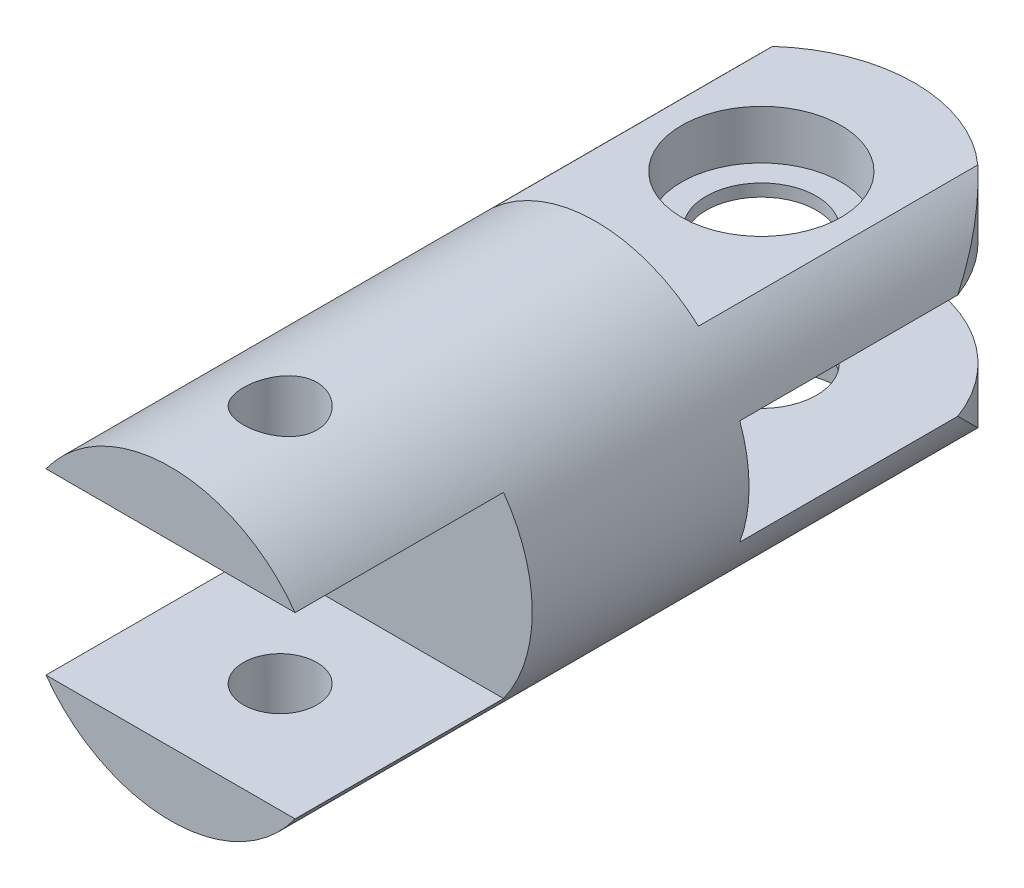
ISO-10303-21;
HEADER;
FILE_DESCRIPTION(('STEP AP214'),'2;1');
FILE_NAME('part.step','',(''),(''),'','','');
FILE_SCHEMA(('AUTOMOTIVE_DESIGN { 1 0 10303 214 1 1 1 1 }'));
ENDSEC;
DATA;
#1=APPLICATION_CONTEXT('core data for automotive mechanical design processes');
#2=APPLICATION_PROTOCOL_DEFINITION('international standard','automotive_design',2000,#1);
#3=PRODUCT_CONTEXT('',#1,'mechanical');
#4=PRODUCT('Part','Part','',(#3));
#5=PRODUCT_RELATED_PRODUCT_CATEGORY('part','',(#4));
#6=PRODUCT_DEFINITION_FORMATION('','',#4);
#7=PRODUCT_DEFINITION_CONTEXT('part definition',#1,'design');
#8=PRODUCT_DEFINITION('design','',#6,#7);
#9=PRODUCT_DEFINITION_SHAPE('','',#8);
#10=(LENGTH_UNIT() NAMED_UNIT(*) SI_UNIT(.MILLI.,.METRE.));
#11=(NAMED_UNIT(*) PLANE_ANGLE_UNIT() SI_UNIT($,.RADIAN.));
#12=(NAMED_UNIT(*) SI_UNIT($,.STERADIAN.) SOLID_ANGLE_UNIT());
#13=UNCERTAINTY_MEASURE_WITH_UNIT(LENGTH_MEASURE(1.E-05),#10,'distance_accuracy_value','');
#14=(GEOMETRIC_REPRESENTATION_CONTEXT(3) GLOBAL_UNCERTAINTY_ASSIGNED_CONTEXT((#13)) GLOBAL_UNIT_ASSIGNED_CONTEXT((#10,
#11,#12)) REPRESENTATION_CONTEXT('',''));
#15=CARTESIAN_POINT('',(0.,0.,0.));
#16=DIRECTION('',(0.,0.,1.));
#17=DIRECTION('',(1.,0.,0.));
#18=AXIS2_PLACEMENT_3D('',#15,#16,#17);
#19=CARTESIAN_POINT('',(0.,0.,-60.6869213965663));
#20=DIRECTION('',(0.,0.,1.));
#21=DIRECTION('',(1.,0.,0.));
#22=AXIS2_PLACEMENT_3D('',#19,#20,#21);
#23=CYLINDRICAL_SURFACE('',#22,12.5);
#24=CARTESIAN_POINT('',(0.,-12.5,-11.9404654544865));
#25=CARTESIAN_POINT('',(-0.165963929028716,-12.4999970714968,-11.9404604304092));
#26=CARTESIAN_POINT('',(-0.331985420928068,-12.4966615634859,-11.9266470442504));
#27=CARTESIAN_POINT('',(-0.659284290971381,-12.4836783946933,-11.8718327148911));
#28=CARTESIAN_POINT('',(-0.820558683214275,-12.4740268462166,-11.8308150264918));
#29=CARTESIAN_POINT('',(-1.13358839471402,-12.4494823208195,-11.7229731199821));
#30=CARTESIAN_POINT('',(-1.28535442324823,-12.4345953702841,-11.6561785646289));
#31=CARTESIAN_POINT('',(-1.57552517879763,-12.4011725442513,-11.4987800180406));
#32=CARTESIAN_POINT('',(-1.71392971475166,-12.3826366165873,-11.4081756864092));
#33=CARTESIAN_POINT('',(-1.97609263393972,-12.3435386014785,-11.2039012761109));
#34=CARTESIAN_POINT('',(-2.0995595210048,-12.3229472454311,-11.0898626734372));
#35=CARTESIAN_POINT('',(-2.32581080811943,-12.2822574370147,-10.8427465854218));
#36=CARTESIAN_POINT('',(-2.42859304624489,-12.2621590363612,-10.7096671124455));
#37=CARTESIAN_POINT('',(-2.61189993555015,-12.224437969062,-10.426019621469));
#38=CARTESIAN_POINT('',(-2.69210377047565,-12.2068525815312,-10.2752388707276));
#39=CARTESIAN_POINT('',(-2.82591582947333,-12.1765733412448,-9.96184561935797));
#40=CARTESIAN_POINT('',(-2.87952794169564,-12.1638787734309,-9.7992348524633));
#41=CARTESIAN_POINT('',(-2.95765058108663,-12.1451184675007,-9.46998888121755));
#42=CARTESIAN_POINT('',(-2.98268262400617,-12.1389341034343,-9.30348433296095));
#43=CARTESIAN_POINT('',(-3.00455808879087,-12.1335389605945,-8.9685330748437));
#44=CARTESIAN_POINT('',(-3.00140571682399,-12.1343271412568,-8.80008665852954));
#45=CARTESIAN_POINT('',(-2.96741912081942,-12.1426811387008,-8.46998948847357));
#46=CARTESIAN_POINT('',(-2.93720103400494,-12.1500960921292,-8.3082708892969));
#47=CARTESIAN_POINT('',(-2.85092141637189,-12.1706283738785,-7.99226813783862));
#48=CARTESIAN_POINT('',(-2.79485817372027,-12.1837460799133,-7.83798447875203));
#49=CARTESIAN_POINT('',(-2.65794121231782,-12.2143476734445,-7.5395524764021));
#50=CARTESIAN_POINT('',(-2.5768594824696,-12.2318714325758,-7.39551300156977));
#51=CARTESIAN_POINT('',(-2.39236688956383,-12.2692875046197,-7.12286095376388));
#52=CARTESIAN_POINT('',(-2.28895240342647,-12.2891802016137,-6.99425088920135));
#53=CARTESIAN_POINT('',(-2.05951493908847,-12.329732025739,-6.75257188416772));
#54=CARTESIAN_POINT('',(-1.93297064389908,-12.3503975788014,-6.63999835542424));
#55=CARTESIAN_POINT('',(-1.66255592459692,-12.3896951594929,-6.43758073474007));
#56=CARTESIAN_POINT('',(-1.51868504982141,-12.4083271342049,-6.34773723419384));
#57=CARTESIAN_POINT('',(-1.21702847718581,-12.4415394956922,-6.19316823387368));
#58=CARTESIAN_POINT('',(-1.05920278696054,-12.4561077058019,-6.12851799824867));
#59=CARTESIAN_POINT('',(-0.734497606078675,-12.4794620474154,-6.02680037543787));
#60=CARTESIAN_POINT('',(-0.567619713387661,-12.4882491958651,-5.98972813685964));
#61=CARTESIAN_POINT('',(-0.233787399651664,-12.4989027542709,-5.94496338983442));
#62=CARTESIAN_POINT('',(-0.0669284805450073,-12.5009282130753,-5.93659556202488));
#63=CARTESIAN_POINT('',(0.26580438158663,-12.4982807419474,-5.94763222133736));
#64=CARTESIAN_POINT('',(0.431678404764953,-12.4936083648176,-5.96703441647369));
#65=CARTESIAN_POINT('',(0.755422580108848,-12.4781916395217,-6.03250243300284));
#66=CARTESIAN_POINT('',(0.913370579311304,-12.4675301590363,-6.07820456406026));
#67=CARTESIAN_POINT('',(1.21935330013476,-12.4413335015664,-6.19456364618172));
#68=CARTESIAN_POINT('',(1.3673870666415,-12.4257978558334,-6.26522299746456));
#69=CARTESIAN_POINT('',(1.6520615099557,-12.3911910149582,-6.43083204808431));
#70=CARTESIAN_POINT('',(1.78847176740355,-12.3720653178033,-6.52616617141083));
#71=CARTESIAN_POINT('',(2.04359904096632,-12.3324936406987,-6.73792238349987));
#72=CARTESIAN_POINT('',(2.16231325074337,-12.3120474520734,-6.85434781056723));
#73=CARTESIAN_POINT('',(2.38142453789941,-12.2715742142771,-7.10810628569501));
#74=CARTESIAN_POINT('',(2.4813497404737,-12.2515669262668,-7.24585057656856));
#75=CARTESIAN_POINT('',(2.65666020824081,-12.2147538797452,-7.53655588238319));
#76=CARTESIAN_POINT('',(2.7320465722335,-12.1979479778962,-7.68951621557993));
#77=CARTESIAN_POINT('',(2.85558993518171,-12.1696189519335,-8.00547796803044));
#78=CARTESIAN_POINT('',(2.90390754385905,-12.1580647463107,-8.16841365790768));
#79=CARTESIAN_POINT('',(2.97238380283979,-12.1415072663683,-8.50041163950715));
#80=CARTESIAN_POINT('',(2.99254804274991,-12.1365026916888,-8.66947270824823));
#81=CARTESIAN_POINT('',(3.00387066449353,-12.1337046220624,-9.00413615476706));
#82=CARTESIAN_POINT('',(2.99578106592266,-12.1357241633848,-9.16971195081315));
#83=CARTESIAN_POINT('',(2.95253345626267,-12.1463176460425,-9.49706521871015));
#84=CARTESIAN_POINT('',(2.91737590900096,-12.1548914750658,-9.65884275559781));
#85=CARTESIAN_POINT('',(2.82138591303537,-12.1775274976748,-9.9732630070347));
#86=CARTESIAN_POINT('',(2.76068402045612,-12.191561756094,-10.1259477270702));
#87=CARTESIAN_POINT('',(2.61543373580583,-12.2235433612686,-10.4190698683701));
#88=CARTESIAN_POINT('',(2.53088229934855,-12.2414912075257,-10.5595057230728));
#89=CARTESIAN_POINT('',(2.33793007708464,-12.279819325529,-10.827802454606));
#90=CARTESIAN_POINT('',(2.22900267979018,-12.3002478697533,-10.9552777775852));
#91=CARTESIAN_POINT('',(1.99143074773237,-12.3409359831145,-11.1903854425384));
#92=CARTESIAN_POINT('',(1.86278158874234,-12.361195511444,-11.2980131176967));
#93=CARTESIAN_POINT('',(1.5868829988014,-12.3996570299581,-11.4920747140412));
#94=CARTESIAN_POINT('',(1.43936414359402,-12.4178200201219,-11.5781338599285));
#95=CARTESIAN_POINT('',(1.13153622828567,-12.4496380610582,-11.7240949872343));
#96=CARTESIAN_POINT('',(0.971236973691223,-12.4632965272855,-11.7840167978781));
#97=CARTESIAN_POINT('',(0.675887025694768,-12.4824059901497,-11.8665040796242));
#98=CARTESIAN_POINT('',(0.542312066268424,-12.4889599449579,-11.8941820702722));
#99=CARTESIAN_POINT('',(0.272504227478251,-12.4977580149525,-11.9311642353383));
#100=CARTESIAN_POINT('',(0.136271517915778,-12.5000024045682,-11.940469579712));
#101=CARTESIAN_POINT('',(0.,-12.5,-11.9404654544865));
#102=B_SPLINE_CURVE_WITH_KNOTS('',3,(#24,#25,#26,#27,#28,#29,#30,#31,#32,#33,#34,#35,#36,#37,
#38,#39,#40,#41,#42,#43,#44,#45,#46,#47,#48,#49,#50,#51,#52,#53,#54,#55,#56,#57,#58,#59,#60,#61,
#62,#63,#64,#65,#66,#67,#68,#69,#70,#71,#72,#73,#74,#75,#76,#77,#78,#79,#80,#81,#82,#83,#84,#85,
#86,#87,#88,#89,#90,#91,#92,#93,#94,#95,#96,#97,#98,#99,#100,#101),.UNSPECIFIED.,.T.,.F.,(4,2,2,
2,2,2,2,2,2,2,2,2,2,2,2,2,2,2,2,2,2,2,2,2,2,2,2,2,2,2,2,2,2,2,2,2,2,2,4),(0.,0.497392599366679,
0.995091645758825,1.49221966408501,1.9893547899852,2.49500570148357,3.00070943533307,
3.51327262050849,4.02576083835037,4.52873995359111,5.03164400680466,5.52338274964839,
6.01515406709138,6.51154667521171,7.00801987450003,7.51749958381935,8.02699254752171,
8.53799614678204,9.04890983140415,9.54771776810826,10.0464845383097,10.5385143736981,
11.0305915421211,11.5308523313794,12.031192370573,12.5427824523192,13.0543496229378,
13.5628484119093,14.0712462285018,14.5662165454702,15.0611783809799,15.5536406351284,
16.0461657803879,16.5505844610431,17.0551215958269,17.5678974206352,18.0802835459069,
18.4887142303991,18.897118905514),.UNSPECIFIED.);
#103=CARTESIAN_POINT('',(0.,-12.5,-11.9404654544865));
#104=VERTEX_POINT('',#103);
#105=EDGE_CURVE('E257',#104,#104,#102,.T.);
#106=ORIENTED_EDGE('',*,*,#105,.T.);
#107=EDGE_LOOP('',(#106));
#108=FACE_BOUND('',#107,.T.);
#109=CARTESIAN_POINT('',(0.,0.,-48.1869213965663));
#110=DIRECTION('',(0.,0.707106781186547,0.707106781186547));
#111=DIRECTION('',(0.,-0.707106781186547,0.707106781186547));
#112=AXIS2_PLACEMENT_3D('',#109,#110,#111);
#113=ELLIPSE('',#112,17.6776695296637,12.5);
#114=CARTESIAN_POINT('',(-11.7434279078634,4.28274456077105,-52.4696659573374));
#115=VERTEX_POINT('',#114);
#116=CARTESIAN_POINT('',(-8.37141884147935,9.28274456077105,-57.4696659573374));
#117=VERTEX_POINT('',#116);
#118=EDGE_CURVE('E157',#115,#117,#113,.F.);
#119=ORIENTED_EDGE('',*,*,#118,.F.);
#120=DIRECTION('',(0.,0.,-1.));
#121=VECTOR('',#120,1.);
#122=CARTESIAN_POINT('',(-11.7434279078634,4.28274456077105,-34.6869213965663));
#123=LINE('',#122,#121);
#124=CARTESIAN_POINT('',(-11.7434279078634,4.28274456077105,-34.6869213965663));
#125=VERTEX_POINT('',#124);
#126=EDGE_CURVE('E114',#125,#115,#123,.T.);
#127=ORIENTED_EDGE('',*,*,#126,.F.);
#128=CARTESIAN_POINT('',(0.,0.,-34.6869213965663));
#129=DIRECTION('',(0.,0.,-1.));
#130=DIRECTION('',(-1.,0.,0.));
#131=AXIS2_PLACEMENT_3D('',#128,#129,#130);
#132=CIRCLE('',#131,12.5);
#133=CARTESIAN_POINT('',(-11.7434279078634,-4.28274456077105,-34.6869213965663));
#134=VERTEX_POINT('',#133);
#135=EDGE_CURVE('E100',#134,#125,#132,.T.);
#136=ORIENTED_EDGE('',*,*,#135,.F.);
#137=DIRECTION('',(0.,0.,-1.));
#138=VECTOR('',#137,1.);
#139=CARTESIAN_POINT('',(-11.7434279078634,-4.28274456077105,-34.6869213965663));
#140=LINE('',#139,#138);
#141=CARTESIAN_POINT('',(-11.7434279078634,-4.28274456077105,-52.4696659573374));
#142=VERTEX_POINT('',#141);
#143=EDGE_CURVE('E167',#134,#142,#140,.T.);
#144=ORIENTED_EDGE('',*,*,#143,.T.);
#145=CARTESIAN_POINT('',(0.,0.,-48.1869213965663));
#146=DIRECTION('',(0.,-0.707106781186547,0.707106781186547));
#147=DIRECTION('',(0.,0.707106781186547,0.707106781186547));
#148=AXIS2_PLACEMENT_3D('',#145,#146,#147);
#149=ELLIPSE('',#148,17.6776695296637,12.5);
#150=CARTESIAN_POINT('',(-8.37141884147936,-9.28274456077105,-57.4696659573374));
#151=VERTEX_POINT('',#150);
#152=EDGE_CURVE('E161',#151,#142,#149,.F.);
#153=ORIENTED_EDGE('',*,*,#152,.F.);
#154=DIRECTION('',(0.,0.,-1.));
#155=VECTOR('',#154,1.);
#156=CARTESIAN_POINT('',(-8.37141884147936,-9.28274456077105,-34.6869213965663));
#157=LINE('',#156,#155);
#158=CARTESIAN_POINT('',(-8.37141884147936,-9.28274456077105,-34.6869213965663));
#159=VERTEX_POINT('',#158);
#160=EDGE_CURVE('E101',#159,#151,#157,.T.);
#161=ORIENTED_EDGE('',*,*,#160,.F.);
#162=CARTESIAN_POINT('',(0.,0.,-34.6869213965663));
#163=DIRECTION('',(0.,0.,-1.));
#164=DIRECTION('',(-1.,0.,0.));
#165=AXIS2_PLACEMENT_3D('',#162,#163,#164);
#166=CIRCLE('',#165,12.5);
#167=CARTESIAN_POINT('',(8.37141884147936,-9.28274456077105,-34.6869213965663));
#168=VERTEX_POINT('',#167);
#169=EDGE_CURVE('E105',#168,#159,#166,.T.);
#170=ORIENTED_EDGE('',*,*,#169,.F.);
#171=DIRECTION('',(0.,0.,-1.));
#172=VECTOR('',#171,1.);
#173=CARTESIAN_POINT('',(8.37141884147936,-9.28274456077105,-34.6869213965663));
#174=LINE('',#173,#172);
#175=CARTESIAN_POINT('',(8.37141884147936,-9.28274456077105,-57.4696659573374));
#176=VERTEX_POINT('',#175);
#177=EDGE_CURVE('E89',#168,#176,#174,.T.);
#178=ORIENTED_EDGE('',*,*,#177,.T.);
#179=CARTESIAN_POINT('',(11.7434279078634,-4.28274456077105,-52.4696659573374));
#180=VERTEX_POINT('',#179);
#181=EDGE_CURVE('E111',#180,#176,#149,.F.);
#182=ORIENTED_EDGE('',*,*,#181,.F.);
#183=DIRECTION('',(0.,0.,-1.));
#184=VECTOR('',#183,1.);
#185=CARTESIAN_POINT('',(11.7434279078635,-4.28274456077104,-34.6869213965663));
#186=LINE('',#185,#184);
#187=CARTESIAN_POINT('',(11.7434279078635,-4.28274456077104,-34.6869213965663));
#188=VERTEX_POINT('',#187);
#189=EDGE_CURVE('E185',#188,#180,#186,.T.);
#190=ORIENTED_EDGE('',*,*,#189,.F.);
#191=CARTESIAN_POINT('',(0.,0.,-34.6869213965663));
#192=DIRECTION('',(0.,0.,-1.));
#193=DIRECTION('',(-1.,0.,0.));
#194=AXIS2_PLACEMENT_3D('',#191,#192,#193);
#195=CIRCLE('',#194,12.5);
#196=CARTESIAN_POINT('',(11.7434279078634,4.28274456077105,-34.6869213965663));
#197=VERTEX_POINT('',#196);
#198=EDGE_CURVE('E178',#197,#188,#195,.T.);
#199=ORIENTED_EDGE('',*,*,#198,.F.);
#200=DIRECTION('',(0.,0.,-1.));
#201=VECTOR('',#200,1.);
#202=CARTESIAN_POINT('',(11.7434279078634,4.28274456077105,-34.6869213965663));
#203=LINE('',#202,#201);
#204=CARTESIAN_POINT('',(11.7434279078634,4.28274456077105,-52.4696659573374));
#205=VERTEX_POINT('',#204);
#206=EDGE_CURVE('E187',#197,#205,#203,.T.);
#207=ORIENTED_EDGE('',*,*,#206,.T.);
#208=CARTESIAN_POINT('',(8.37141884147935,9.28274456077105,-57.4696659573374));
#209=VERTEX_POINT('',#208);
#210=EDGE_CURVE('E154',#209,#205,#113,.F.);
#211=ORIENTED_EDGE('',*,*,#210,.F.);
#212=DIRECTION('',(0.,0.,-1.));
#213=VECTOR('',#212,1.);
#214=CARTESIAN_POINT('',(8.37141884147936,9.28274456077105,-34.6869213965663));
#215=LINE('',#214,#213);
#216=CARTESIAN_POINT('',(8.37141884147936,9.28274456077105,-34.6869213965663));
#217=VERTEX_POINT('',#216);
#218=EDGE_CURVE('E169',#217,#209,#215,.T.);
#219=ORIENTED_EDGE('',*,*,#218,.F.);
#220=CARTESIAN_POINT('',(0.,0.,-34.6869213965663));
#221=DIRECTION('',(0.,0.,-1.));
#222=DIRECTION('',(-1.,0.,0.));
#223=AXIS2_PLACEMENT_3D('',#220,#221,#222);
#224=CIRCLE('',#223,12.5);
#225=CARTESIAN_POINT('',(-8.37141884147936,9.28274456077105,-34.6869213965663));
#226=VERTEX_POINT('',#225);
#227=EDGE_CURVE('E164',#226,#217,#224,.T.);
#228=ORIENTED_EDGE('',*,*,#227,.F.);
#229=DIRECTION('',(0.,0.,-1.));
#230=VECTOR('',#229,1.);
#231=CARTESIAN_POINT('',(-8.37141884147936,9.28274456077105,-34.6869213965663));
#232=LINE('',#231,#230);
#233=EDGE_CURVE('E62',#226,#117,#232,.T.);
#234=ORIENTED_EDGE('',*,*,#233,.T.);
#235=EDGE_LOOP('',(#119,#127,#136,#144,#153,#161,#170,#178,#182,#190,#199,#207,#211,#219,#228,#234));
#236=FACE_BOUND('',#235,.T.);
#237=CARTESIAN_POINT('',(0.,0.,0.));
#238=DIRECTION('',(0.,0.,1.));
#239=DIRECTION('',(1.,0.,0.));
#240=AXIS2_PLACEMENT_3D('',#237,#238,#239);
#241=CIRCLE('',#240,12.5);
#242=CARTESIAN_POINT('',(-10.1592108826775,-7.28288639491837,0.));
#243=VERTEX_POINT('',#242);
#244=CARTESIAN_POINT('',(10.1592108826775,-7.28288639491837,0.));
#245=VERTEX_POINT('',#244);
#246=EDGE_CURVE('E119',#243,#245,#241,.T.);
#247=ORIENTED_EDGE('',*,*,#246,.F.);
#248=DIRECTION('',(0.,0.,1.));
#249=VECTOR('',#248,1.);
#250=CARTESIAN_POINT('',(-10.1592108826775,-7.28288639491837,-17.));
#251=LINE('',#250,#249);
#252=CARTESIAN_POINT('',(-10.1592108826775,-7.28288639491837,-17.));
#253=VERTEX_POINT('',#252);
#254=EDGE_CURVE('E484',#253,#243,#251,.T.);
#255=ORIENTED_EDGE('',*,*,#254,.F.);
#256=CARTESIAN_POINT('',(0.,0.,-17.));
#257=DIRECTION('',(0.,0.,1.));
#258=DIRECTION('',(1.,0.,0.));
#259=AXIS2_PLACEMENT_3D('',#256,#257,#258);
#260=CIRCLE('',#259,12.5);
#261=CARTESIAN_POINT('',(-10.1592108826775,7.28288639491837,-17.));
#262=VERTEX_POINT('',#261);
#263=EDGE_CURVE('E480',#262,#253,#260,.T.);
#264=ORIENTED_EDGE('',*,*,#263,.F.);
#265=DIRECTION('',(0.,0.,1.));
#266=VECTOR('',#265,1.);
#267=CARTESIAN_POINT('',(-10.1592108826775,7.28288639491837,-17.));
#268=LINE('',#267,#266);
#269=CARTESIAN_POINT('',(-10.1592108826775,7.28288639491837,0.));
#270=VERTEX_POINT('',#269);
#271=EDGE_CURVE('E476',#262,#270,#268,.T.);
#272=ORIENTED_EDGE('',*,*,#271,.T.);
#273=CARTESIAN_POINT('',(10.1592108826775,7.28288639491837,0.));
#274=VERTEX_POINT('',#273);
#275=EDGE_CURVE('E46',#274,#270,#241,.T.);
#276=ORIENTED_EDGE('',*,*,#275,.F.);
#277=DIRECTION('',(0.,0.,1.));
#278=VECTOR('',#277,1.);
#279=CARTESIAN_POINT('',(10.1592108826775,7.28288639491837,-17.));
#280=LINE('',#279,#278);
#281=CARTESIAN_POINT('',(10.1592108826775,7.28288639491837,-17.));
#282=VERTEX_POINT('',#281);
#283=EDGE_CURVE('E54',#282,#274,#280,.T.);
#284=ORIENTED_EDGE('',*,*,#283,.F.);
#285=CARTESIAN_POINT('',(0.,0.,-17.));
#286=DIRECTION('',(0.,0.,1.));
#287=DIRECTION('',(1.,0.,0.));
#288=AXIS2_PLACEMENT_3D('',#285,#286,#287);
#289=CIRCLE('',#288,12.5);
#290=CARTESIAN_POINT('',(10.1592108826775,-7.28288639491837,-17.));
#291=VERTEX_POINT('',#290);
#292=EDGE_CURVE('E492',#291,#282,#289,.T.);
#293=ORIENTED_EDGE('',*,*,#292,.F.);
#294=DIRECTION('',(0.,0.,1.));
#295=VECTOR('',#294,1.);
#296=CARTESIAN_POINT('',(10.1592108826775,-7.28288639491837,-17.));
#297=LINE('',#296,#295);
#298=EDGE_CURVE('E139',#291,#245,#297,.T.);
#299=ORIENTED_EDGE('',*,*,#298,.T.);
#300=EDGE_LOOP('',(#247,#255,#264,#272,#276,#284,#293,#299));
#301=FACE_BOUND('',#300,.T.);
#302=CARTESIAN_POINT('',(0.,12.5,-11.9404654544865));
#303=CARTESIAN_POINT('',(0.165963929028716,12.4999970714968,-11.9404604304092));
#304=CARTESIAN_POINT('',(0.331985420928068,12.4966615634859,-11.9266470442504));
#305=CARTESIAN_POINT('',(0.659284290971381,12.4836783946933,-11.8718327148911));
#306=CARTESIAN_POINT('',(0.820558683214275,12.4740268462166,-11.8308150264918));
#307=CARTESIAN_POINT('',(1.13358839471402,12.4494823208195,-11.7229731199821));
#308=CARTESIAN_POINT('',(1.28535442324823,12.4345953702841,-11.6561785646289));
#309=CARTESIAN_POINT('',(1.57552517879763,12.4011725442513,-11.4987800180406));
#310=CARTESIAN_POINT('',(1.71392971475166,12.3826366165873,-11.4081756864092));
#311=CARTESIAN_POINT('',(1.97609263393972,12.3435386014785,-11.2039012761109));
#312=CARTESIAN_POINT('',(2.0995595210048,12.3229472454311,-11.0898626734372));
#313=CARTESIAN_POINT('',(2.32581080811943,12.2822574370147,-10.8427465854218));
#314=CARTESIAN_POINT('',(2.42859304624489,12.2621590363612,-10.7096671124455));
#315=CARTESIAN_POINT('',(2.61189993555015,12.224437969062,-10.426019621469));
#316=CARTESIAN_POINT('',(2.69210377047565,12.2068525815312,-10.2752388707276));
#317=CARTESIAN_POINT('',(2.82591582947333,12.1765733412448,-9.96184561935797));
#318=CARTESIAN_POINT('',(2.87952794169564,12.1638787734309,-9.7992348524633));
#319=CARTESIAN_POINT('',(2.95765058108663,12.1451184675007,-9.46998888121755));
#320=CARTESIAN_POINT('',(2.98268262400617,12.1389341034343,-9.30348433296095));
#321=CARTESIAN_POINT('',(3.00455808879087,12.1335389605945,-8.9685330748437));
#322=CARTESIAN_POINT('',(3.00140571682399,12.1343271412568,-8.80008665852954));
#323=CARTESIAN_POINT('',(2.96741912081942,12.1426811387008,-8.46998948847357));
#324=CARTESIAN_POINT('',(2.93720103400494,12.1500960921292,-8.3082708892969));
#325=CARTESIAN_POINT('',(2.85092141637189,12.1706283738785,-7.99226813783862));
#326=CARTESIAN_POINT('',(2.79485817372027,12.1837460799133,-7.83798447875203));
#327=CARTESIAN_POINT('',(2.65794121231782,12.2143476734445,-7.5395524764021));
#328=CARTESIAN_POINT('',(2.5768594824696,12.2318714325758,-7.39551300156977));
#329=CARTESIAN_POINT('',(2.39236688956383,12.2692875046197,-7.12286095376388));
#330=CARTESIAN_POINT('',(2.28895240342647,12.2891802016137,-6.99425088920135));
#331=CARTESIAN_POINT('',(2.05951493908847,12.329732025739,-6.75257188416772));
#332=CARTESIAN_POINT('',(1.93297064389908,12.3503975788014,-6.63999835542424));
#333=CARTESIAN_POINT('',(1.66255592459692,12.3896951594929,-6.43758073474007));
#334=CARTESIAN_POINT('',(1.51868504982141,12.4083271342049,-6.34773723419384));
#335=CARTESIAN_POINT('',(1.21702847718581,12.4415394956922,-6.19316823387368));
#336=CARTESIAN_POINT('',(1.05920278696054,12.4561077058019,-6.12851799824867));
#337=CARTESIAN_POINT('',(0.734497606078675,12.4794620474154,-6.02680037543787));
#338=CARTESIAN_POINT('',(0.567619713387661,12.4882491958651,-5.98972813685964));
#339=CARTESIAN_POINT('',(0.233787399651664,12.4989027542709,-5.94496338983442));
#340=CARTESIAN_POINT('',(0.0669284805450073,12.5009282130753,-5.93659556202488));
#341=CARTESIAN_POINT('',(-0.26580438158663,12.4982807419474,-5.94763222133736));
#342=CARTESIAN_POINT('',(-0.431678404764953,12.4936083648176,-5.96703441647369));
#343=CARTESIAN_POINT('',(-0.755422580108848,12.4781916395217,-6.03250243300284));
#344=CARTESIAN_POINT('',(-0.913370579311304,12.4675301590363,-6.07820456406026));
#345=CARTESIAN_POINT('',(-1.21935330013476,12.4413335015664,-6.19456364618172));
#346=CARTESIAN_POINT('',(-1.3673870666415,12.4257978558334,-6.26522299746456));
#347=CARTESIAN_POINT('',(-1.6520615099557,12.3911910149582,-6.43083204808431));
#348=CARTESIAN_POINT('',(-1.78847176740355,12.3720653178033,-6.52616617141083));
#349=CARTESIAN_POINT('',(-2.04359904096632,12.3324936406987,-6.73792238349987));
#350=CARTESIAN_POINT('',(-2.16231325074337,12.3120474520734,-6.85434781056723));
#351=CARTESIAN_POINT('',(-2.38142453789941,12.2715742142771,-7.10810628569501));
#352=CARTESIAN_POINT('',(-2.4813497404737,12.2515669262668,-7.24585057656856));
#353=CARTESIAN_POINT('',(-2.65666020824081,12.2147538797452,-7.53655588238319));
#354=CARTESIAN_POINT('',(-2.7320465722335,12.1979479778962,-7.68951621557993));
#355=CARTESIAN_POINT('',(-2.85558993518171,12.1696189519335,-8.00547796803044));
#356=CARTESIAN_POINT('',(-2.90390754385905,12.1580647463107,-8.16841365790768));
#357=CARTESIAN_POINT('',(-2.97238380283979,12.1415072663683,-8.50041163950715));
#358=CARTESIAN_POINT('',(-2.99254804274991,12.1365026916888,-8.66947270824823));
#359=CARTESIAN_POINT('',(-3.00387066449353,12.1337046220624,-9.00413615476706));
#360=CARTESIAN_POINT('',(-2.99578106592266,12.1357241633848,-9.16971195081315));
#361=CARTESIAN_POINT('',(-2.95253345626267,12.1463176460425,-9.49706521871015));
#362=CARTESIAN_POINT('',(-2.91737590900096,12.1548914750658,-9.65884275559781));
#363=CARTESIAN_POINT('',(-2.82138591303537,12.1775274976748,-9.9732630070347));
#364=CARTESIAN_POINT('',(-2.76068402045612,12.191561756094,-10.1259477270702));
#365=CARTESIAN_POINT('',(-2.61543373580583,12.2235433612686,-10.4190698683701));
#366=CARTESIAN_POINT('',(-2.53088229934855,12.2414912075257,-10.5595057230728));
#367=CARTESIAN_POINT('',(-2.33793007708464,12.279819325529,-10.827802454606));
#368=CARTESIAN_POINT('',(-2.22900267979018,12.3002478697533,-10.9552777775852));
#369=CARTESIAN_POINT('',(-1.99143074773237,12.3409359831145,-11.1903854425384));
#370=CARTESIAN_POINT('',(-1.86278158874234,12.361195511444,-11.2980131176967));
#371=CARTESIAN_POINT('',(-1.5868829988014,12.3996570299581,-11.4920747140412));
#372=CARTESIAN_POINT('',(-1.43936414359402,12.4178200201219,-11.5781338599285));
#373=CARTESIAN_POINT('',(-1.13153622828567,12.4496380610582,-11.7240949872343));
#374=CARTESIAN_POINT('',(-0.971236973691223,12.4632965272855,-11.7840167978781));
#375=CARTESIAN_POINT('',(-0.675887025694768,12.4824059901497,-11.8665040796242));
#376=CARTESIAN_POINT('',(-0.542312066268424,12.4889599449579,-11.8941820702722));
#377=CARTESIAN_POINT('',(-0.272504227478251,12.4977580149525,-11.9311642353383));
#378=CARTESIAN_POINT('',(-0.136271517915778,12.5000024045682,-11.940469579712));
#379=CARTESIAN_POINT('',(0.,12.5,-11.9404654544865));
#380=B_SPLINE_CURVE_WITH_KNOTS('',3,(#302,#303,#304,#305,#306,#307,#308,#309,#310,#311,#312,
#313,#314,#315,#316,#317,#318,#319,#320,#321,#322,#323,#324,#325,#326,#327,#328,#329,#330,#331,
#332,#333,#334,#335,#336,#337,#338,#339,#340,#341,#342,#343,#344,#345,#346,#347,#348,#349,#350,
#351,#352,#353,#354,#355,#356,#357,#358,#359,#360,#361,#362,#363,#364,#365,#366,#367,#368,#369,
#370,#371,#372,#373,#374,#375,#376,#377,#378,#379),.UNSPECIFIED.,.T.,.F.,(4,2,2,2,2,2,2,2,2,2,2,
2,2,2,2,2,2,2,2,2,2,2,2,2,2,2,2,2,2,2,2,2,2,2,2,2,2,2,4),(0.,0.497392599366679,
0.995091645758825,1.49221966408501,1.9893547899852,2.49500570148357,3.00070943533307,
3.51327262050849,4.02576083835037,4.52873995359111,5.03164400680466,5.52338274964839,
6.01515406709138,6.51154667521171,7.00801987450003,7.51749958381935,8.02699254752171,
8.53799614678204,9.04890983140415,9.54771776810826,10.0464845383097,10.5385143736981,
11.0305915421211,11.5308523313794,12.031192370573,12.5427824523192,13.0543496229378,
13.5628484119093,14.0712462285018,14.5662165454702,15.0611783809799,15.5536406351284,
16.0461657803879,16.5505844610431,17.0551215958269,17.5678974206352,18.0802835459069,
18.4887142303991,18.897118905514),.UNSPECIFIED.);
#381=CARTESIAN_POINT('',(0.,12.5,-11.9404654544865));
#382=VERTEX_POINT('',#381);
#383=EDGE_CURVE('E259',#382,#382,#380,.T.);
#384=ORIENTED_EDGE('',*,*,#383,.T.);
#385=EDGE_LOOP('',(#384));
#386=FACE_BOUND('',#385,.T.);
#387=ADVANCED_FACE('F37',(#108,#236,#301,#386),#23,.T.);
#388=CARTESIAN_POINT('',(0.,0.,0.));
#389=DIRECTION('',(0.,0.,1.));
#390=DIRECTION('',(1.,0.,0.));
#391=AXIS2_PLACEMENT_3D('',#388,#389,#390);
#392=PLANE('',#391);
#393=ORIENTED_EDGE('',*,*,#246,.T.);
#394=DIRECTION('',(-1.,0.,0.));
#395=VECTOR('',#394,1.);
#396=CARTESIAN_POINT('',(10.1592108826775,-7.28288639491837,0.));
#397=LINE('',#396,#395);
#398=EDGE_CURVE('E469',#245,#243,#397,.T.);
#399=ORIENTED_EDGE('',*,*,#398,.T.);
#400=EDGE_LOOP('',(#393,#399));
#401=FACE_BOUND('',#400,.T.);
#402=ADVANCED_FACE('F247',(#401),#392,.T.);
#403=CARTESIAN_POINT('',(0.,-24.8411931736603,-48.1869213965663));
#404=DIRECTION('',(0.,1.,0.));
#405=DIRECTION('',(0.,0.,1.));
#406=AXIS2_PLACEMENT_3D('',#403,#404,#405);
#407=CYLINDRICAL_SURFACE('',#406,4.50000000000001);
#408=CARTESIAN_POINT('',(0.,-4.28274456077105,-48.1869213965663));
#409=DIRECTION('',(0.,-1.,0.));
#410=DIRECTION('',(0.,0.,-1.));
#411=AXIS2_PLACEMENT_3D('',#408,#409,#410);
#412=CIRCLE('',#411,4.50000000000001);
#413=CARTESIAN_POINT('',(0.,-4.28274456077105,-52.6869213965663));
#414=VERTEX_POINT('',#413);
#415=EDGE_CURVE('E148',#414,#414,#412,.T.);
#416=ORIENTED_EDGE('',*,*,#415,.F.);
#417=EDGE_LOOP('',(#416));
#418=FACE_BOUND('',#417,.T.);
#419=CARTESIAN_POINT('',(0.,-5.28274456077107,-48.1869213965663));
#420=DIRECTION('',(0.,-1.,0.));
#421=DIRECTION('',(0.,0.,-1.));
#422=AXIS2_PLACEMENT_3D('',#419,#420,#421);
#423=CIRCLE('',#422,4.50000000000001);
#424=CARTESIAN_POINT('',(0.,-5.28274456077107,-52.6869213965663));
#425=VERTEX_POINT('',#424);
#426=EDGE_CURVE('E125',#425,#425,#423,.F.);
#427=ORIENTED_EDGE('',*,*,#426,.F.);
#428=EDGE_LOOP('',(#427));
#429=FACE_BOUND('',#428,.T.);
#430=ADVANCED_FACE('F252',(#418,#429),#407,.F.);
#431=CARTESIAN_POINT('',(0.,4.28274456077105,-48.1869213965663));
#432=DIRECTION('',(0.,1.,0.));
#433=DIRECTION('',(0.,0.,1.));
#434=AXIS2_PLACEMENT_3D('',#431,#432,#433);
#435=CIRCLE('',#434,4.50000000000001);
#436=CARTESIAN_POINT('',(0.,4.28274456077105,-43.6869213965663));
#437=VERTEX_POINT('',#436);
#438=EDGE_CURVE('E123',#437,#437,#435,.T.);
#439=ORIENTED_EDGE('',*,*,#438,.F.);
#440=EDGE_LOOP('',(#439));
#441=FACE_BOUND('',#440,.T.);
#442=CARTESIAN_POINT('',(0.,5.28274456077107,-48.1869213965663));
#443=DIRECTION('',(0.,1.,0.));
#444=DIRECTION('',(0.,0.,1.));
#445=AXIS2_PLACEMENT_3D('',#442,#443,#444);
#446=CIRCLE('',#445,4.50000000000001);
#447=CARTESIAN_POINT('',(0.,5.28274456077107,-43.6869213965663));
#448=VERTEX_POINT('',#447);
#449=EDGE_CURVE('E121',#448,#448,#446,.F.);
#450=ORIENTED_EDGE('',*,*,#449,.F.);
#451=EDGE_LOOP('',(#450));
#452=FACE_BOUND('',#451,.T.);
#453=ADVANCED_FACE('F312',(#441,#452),#407,.F.);
#454=DIRECTION('',(-1.,0.,0.));
#455=VECTOR('',#454,1.);
#456=CARTESIAN_POINT('',(10.1592108826775,7.28288639491837,0.));
#457=LINE('',#456,#455);
#458=EDGE_CURVE('E263',#274,#270,#457,.T.);
#459=ORIENTED_EDGE('',*,*,#458,.F.);
#460=ORIENTED_EDGE('',*,*,#275,.T.);
#461=EDGE_LOOP('',(#459,#460));
#462=FACE_BOUND('',#461,.T.);
#463=ADVANCED_FACE('F254',(#462),#392,.T.);
#464=CARTESIAN_POINT('',(-8.37141884147936,-9.28274456077105,-34.6869213965663));
#465=DIRECTION('',(0.,1.,0.));
#466=DIRECTION('',(0.,0.,1.));
#467=AXIS2_PLACEMENT_3D('',#464,#465,#466);
#468=PLANE('',#467);
#469=CARTESIAN_POINT('',(0.,-9.28274456077105,-48.1869213965663));
#470=DIRECTION('',(0.,1.,0.));
#471=DIRECTION('',(0.,0.,1.));
#472=AXIS2_PLACEMENT_3D('',#469,#470,#471);
#473=CIRCLE('',#472,6.50000000000001);
#474=CARTESIAN_POINT('',(0.,-9.28274456077105,-41.6869213965663));
#475=VERTEX_POINT('',#474);
#476=EDGE_CURVE('E134',#475,#475,#473,.T.);
#477=ORIENTED_EDGE('',*,*,#476,.T.);
#478=EDGE_LOOP('',(#477));
#479=FACE_BOUND('',#478,.T.);
#480=ORIENTED_EDGE('',*,*,#160,.T.);
#481=CARTESIAN_POINT('',(0.,-9.28274456077105,-48.1869213965663));
#482=DIRECTION('',(0.,1.,0.));
#483=DIRECTION('',(0.,0.,1.));
#484=AXIS2_PLACEMENT_3D('',#481,#482,#483);
#485=CIRCLE('',#484,12.5);
#486=EDGE_CURVE('E96',#151,#176,#485,.F.);
#487=ORIENTED_EDGE('',*,*,#486,.T.);
#488=ORIENTED_EDGE('',*,*,#177,.F.);
#489=DIRECTION('',(1.,0.,0.));
#490=VECTOR('',#489,1.);
#491=CARTESIAN_POINT('',(-8.37141884147936,-9.28274456077105,-34.6869213965663));
#492=LINE('',#491,#490);
#493=EDGE_CURVE('E93',#159,#168,#492,.T.);
#494=ORIENTED_EDGE('',*,*,#493,.F.);
#495=EDGE_LOOP('',(#480,#487,#488,#494));
#496=FACE_BOUND('',#495,.T.);
#497=ADVANCED_FACE('F92',(#479,#496),#468,.F.);
#498=CARTESIAN_POINT('',(0.,0.,-34.6869213965663));
#499=DIRECTION('',(0.,0.,-1.));
#500=DIRECTION('',(-1.,0.,0.));
#501=AXIS2_PLACEMENT_3D('',#498,#499,#500);
#502=PLANE('',#501);
#503=ORIENTED_EDGE('',*,*,#169,.T.);
#504=ORIENTED_EDGE('',*,*,#493,.T.);
#505=EDGE_LOOP('',(#503,#504));
#506=FACE_BOUND('',#505,.T.);
#507=ADVANCED_FACE('F104',(#506),#502,.T.);
#508=CARTESIAN_POINT('',(-11.7434279078634,-4.28274456077105,-34.6869213965663));
#509=DIRECTION('',(0.,-1.,0.));
#510=DIRECTION('',(0.,0.,-1.));
#511=AXIS2_PLACEMENT_3D('',#508,#509,#510);
#512=PLANE('',#511);
#513=ORIENTED_EDGE('',*,*,#415,.T.);
#514=EDGE_LOOP('',(#513));
#515=FACE_BOUND('',#514,.T.);
#516=CARTESIAN_POINT('',(0.,-4.28274456077105,-48.1869213965663));
#517=DIRECTION('',(0.,-1.,0.));
#518=DIRECTION('',(0.,0.,-1.));
#519=AXIS2_PLACEMENT_3D('',#516,#517,#518);
#520=CIRCLE('',#519,12.5);
#521=EDGE_CURVE('E158',#180,#142,#520,.F.);
#522=ORIENTED_EDGE('',*,*,#521,.T.);
#523=ORIENTED_EDGE('',*,*,#143,.F.);
#524=DIRECTION('',(-1.,0.,0.));
#525=VECTOR('',#524,1.);
#526=CARTESIAN_POINT('',(-11.7434279078634,-4.28274456077105,-34.6869213965663));
#527=LINE('',#526,#525);
#528=EDGE_CURVE('E180',#188,#134,#527,.T.);
#529=ORIENTED_EDGE('',*,*,#528,.F.);
#530=ORIENTED_EDGE('',*,*,#189,.T.);
#531=EDGE_LOOP('',(#522,#523,#529,#530));
#532=FACE_BOUND('',#531,.T.);
#533=ADVANCED_FACE('F230',(#515,#532),#512,.F.);
#534=CARTESIAN_POINT('',(-11.7434279078634,4.28274456077105,-34.6869213965663));
#535=DIRECTION('',(0.,1.,0.));
#536=DIRECTION('',(0.,0.,1.));
#537=AXIS2_PLACEMENT_3D('',#534,#535,#536);
#538=PLANE('',#537);
#539=ORIENTED_EDGE('',*,*,#438,.T.);
#540=EDGE_LOOP('',(#539));
#541=FACE_BOUND('',#540,.T.);
#542=ORIENTED_EDGE('',*,*,#126,.T.);
#543=CARTESIAN_POINT('',(0.,4.28274456077105,-48.1869213965663));
#544=DIRECTION('',(0.,1.,0.));
#545=DIRECTION('',(0.,0.,1.));
#546=AXIS2_PLACEMENT_3D('',#543,#544,#545);
#547=CIRCLE('',#546,12.5);
#548=EDGE_CURVE('E151',#115,#205,#547,.F.);
#549=ORIENTED_EDGE('',*,*,#548,.T.);
#550=ORIENTED_EDGE('',*,*,#206,.F.);
#551=DIRECTION('',(1.,0.,0.));
#552=VECTOR('',#551,1.);
#553=CARTESIAN_POINT('',(-11.7434279078634,4.28274456077105,-34.6869213965663));
#554=LINE('',#553,#552);
#555=EDGE_CURVE('E175',#125,#197,#554,.T.);
#556=ORIENTED_EDGE('',*,*,#555,.F.);
#557=EDGE_LOOP('',(#542,#549,#550,#556));
#558=FACE_BOUND('',#557,.T.);
#559=ADVANCED_FACE('F196',(#541,#558),#538,.F.);
#560=CARTESIAN_POINT('',(0.,0.,-34.6869213965663));
#561=DIRECTION('',(0.,0.,-1.));
#562=DIRECTION('',(-1.,0.,0.));
#563=AXIS2_PLACEMENT_3D('',#560,#561,#562);
#564=PLANE('',#563);
#565=ORIENTED_EDGE('',*,*,#135,.T.);
#566=ORIENTED_EDGE('',*,*,#555,.T.);
#567=ORIENTED_EDGE('',*,*,#198,.T.);
#568=ORIENTED_EDGE('',*,*,#528,.T.);
#569=EDGE_LOOP('',(#565,#566,#567,#568));
#570=FACE_BOUND('',#569,.T.);
#571=ADVANCED_FACE('F232',(#570),#564,.T.);
#572=CARTESIAN_POINT('',(-8.37141884147936,9.28274456077105,-34.6869213965663));
#573=DIRECTION('',(0.,-1.,0.));
#574=DIRECTION('',(0.,0.,-1.));
#575=AXIS2_PLACEMENT_3D('',#572,#573,#574);
#576=PLANE('',#575);
#577=CARTESIAN_POINT('',(0.,9.28274456077105,-48.1869213965663));
#578=DIRECTION('',(0.,1.,0.));
#579=DIRECTION('',(0.,0.,1.));
#580=AXIS2_PLACEMENT_3D('',#577,#578,#579);
#581=CIRCLE('',#580,6.50000000000001);
#582=CARTESIAN_POINT('',(0.,9.28274456077105,-41.6869213965663));
#583=VERTEX_POINT('',#582);
#584=EDGE_CURVE('E127',#583,#583,#581,.T.);
#585=ORIENTED_EDGE('',*,*,#584,.F.);
#586=EDGE_LOOP('',(#585));
#587=FACE_BOUND('',#586,.T.);
#588=CARTESIAN_POINT('',(0.,9.28274456077105,-48.1869213965663));
#589=DIRECTION('',(0.,-1.,0.));
#590=DIRECTION('',(0.,0.,-1.));
#591=AXIS2_PLACEMENT_3D('',#588,#589,#590);
#592=CIRCLE('',#591,12.5);
#593=EDGE_CURVE('E11',#209,#117,#592,.F.);
#594=ORIENTED_EDGE('',*,*,#593,.T.);
#595=ORIENTED_EDGE('',*,*,#233,.F.);
#596=DIRECTION('',(-1.,0.,0.));
#597=VECTOR('',#596,1.);
#598=CARTESIAN_POINT('',(-8.37141884147936,9.28274456077105,-34.6869213965663));
#599=LINE('',#598,#597);
#600=EDGE_CURVE('E166',#217,#226,#599,.T.);
#601=ORIENTED_EDGE('',*,*,#600,.F.);
#602=ORIENTED_EDGE('',*,*,#218,.T.);
#603=EDGE_LOOP('',(#594,#595,#601,#602));
#604=FACE_BOUND('',#603,.T.);
#605=ADVANCED_FACE('F234',(#587,#604),#576,.F.);
#606=CARTESIAN_POINT('',(0.,0.,-34.6869213965663));
#607=DIRECTION('',(0.,0.,-1.));
#608=DIRECTION('',(-1.,0.,0.));
#609=AXIS2_PLACEMENT_3D('',#606,#607,#608);
#610=PLANE('',#609);
#611=ORIENTED_EDGE('',*,*,#227,.T.);
#612=ORIENTED_EDGE('',*,*,#600,.T.);
#613=EDGE_LOOP('',(#611,#612));
#614=FACE_BOUND('',#613,.T.);
#615=ADVANCED_FACE('F240',(#614),#610,.T.);
#616=CARTESIAN_POINT('',(0.,-24.8411931736603,-48.1869213965663));
#617=DIRECTION('',(0.,1.,0.));
#618=DIRECTION('',(0.,0.,1.));
#619=AXIS2_PLACEMENT_3D('',#616,#617,#618);
#620=CYLINDRICAL_SURFACE('',#619,12.5);
#621=ORIENTED_EDGE('',*,*,#593,.F.);
#622=ORIENTED_EDGE('',*,*,#210,.T.);
#623=ORIENTED_EDGE('',*,*,#548,.F.);
#624=ORIENTED_EDGE('',*,*,#118,.T.);
#625=EDGE_LOOP('',(#621,#622,#623,#624));
#626=FACE_BOUND('',#625,.T.);
#627=ADVANCED_FACE('F206',(#626),#620,.T.);
#628=ORIENTED_EDGE('',*,*,#521,.F.);
#629=ORIENTED_EDGE('',*,*,#181,.T.);
#630=ORIENTED_EDGE('',*,*,#486,.F.);
#631=ORIENTED_EDGE('',*,*,#152,.T.);
#632=EDGE_LOOP('',(#628,#629,#630,#631));
#633=FACE_BOUND('',#632,.T.);
#634=ADVANCED_FACE('F226',(#633),#620,.T.);
#635=CARTESIAN_POINT('',(0.,5.28274456077107,-48.1869213965663));
#636=DIRECTION('',(0.,1.,0.));
#637=DIRECTION('',(0.,0.,1.));
#638=AXIS2_PLACEMENT_3D('',#635,#636,#637);
#639=PLANE('',#638);
#640=CARTESIAN_POINT('',(0.,5.28274456077107,-48.1869213965663));
#641=DIRECTION('',(0.,1.,0.));
#642=DIRECTION('',(0.,0.,1.));
#643=AXIS2_PLACEMENT_3D('',#640,#641,#642);
#644=CIRCLE('',#643,6.50000000000001);
#645=CARTESIAN_POINT('',(0.,5.28274456077107,-41.6869213965663));
#646=VERTEX_POINT('',#645);
#647=EDGE_CURVE('E124',#646,#646,#644,.T.);
#648=ORIENTED_EDGE('',*,*,#647,.T.);
#649=EDGE_LOOP('',(#648));
#650=FACE_BOUND('',#649,.T.);
#651=ORIENTED_EDGE('',*,*,#449,.T.);
#652=EDGE_LOOP('',(#651));
#653=FACE_BOUND('',#652,.T.);
#654=ADVANCED_FACE('F301',(#650,#653),#639,.T.);
#655=CARTESIAN_POINT('',(0.,5.28274456077107,-48.1869213965663));
#656=DIRECTION('',(0.,1.,0.));
#657=DIRECTION('',(0.,0.,1.));
#658=AXIS2_PLACEMENT_3D('',#655,#656,#657);
#659=CYLINDRICAL_SURFACE('',#658,6.50000000000001);
#660=ORIENTED_EDGE('',*,*,#647,.F.);
#661=EDGE_LOOP('',(#660));
#662=FACE_BOUND('',#661,.T.);
#663=ORIENTED_EDGE('',*,*,#584,.T.);
#664=EDGE_LOOP('',(#663));
#665=FACE_BOUND('',#664,.T.);
#666=ADVANCED_FACE('F297',(#662,#665),#659,.F.);
#667=CARTESIAN_POINT('',(0.,-5.28274456077107,-48.1869213965663));
#668=DIRECTION('',(0.,-1.,0.));
#669=DIRECTION('',(0.,0.,1.));
#670=AXIS2_PLACEMENT_3D('',#667,#668,#669);
#671=PLANE('',#670);
#672=CARTESIAN_POINT('',(0.,-5.28274456077107,-48.1869213965663));
#673=DIRECTION('',(0.,1.,0.));
#674=DIRECTION('',(0.,0.,1.));
#675=AXIS2_PLACEMENT_3D('',#672,#673,#674);
#676=CIRCLE('',#675,6.50000000000001);
#677=CARTESIAN_POINT('',(0.,-5.28274456077107,-41.6869213965663));
#678=VERTEX_POINT('',#677);
#679=EDGE_CURVE('E128',#678,#678,#676,.T.);
#680=ORIENTED_EDGE('',*,*,#679,.F.);
#681=EDGE_LOOP('',(#680));
#682=FACE_BOUND('',#681,.T.);
#683=ORIENTED_EDGE('',*,*,#426,.T.);
#684=EDGE_LOOP('',(#683));
#685=FACE_BOUND('',#684,.T.);
#686=ADVANCED_FACE('F294',(#682,#685),#671,.T.);
#687=CARTESIAN_POINT('',(0.,-5.28274456077107,-48.1869213965663));
#688=DIRECTION('',(0.,-1.,0.));
#689=DIRECTION('',(0.,0.,-1.));
#690=AXIS2_PLACEMENT_3D('',#687,#688,#689);
#691=CYLINDRICAL_SURFACE('',#690,6.50000000000001);
#692=ORIENTED_EDGE('',*,*,#679,.T.);
#693=EDGE_LOOP('',(#692));
#694=FACE_BOUND('',#693,.T.);
#695=ORIENTED_EDGE('',*,*,#476,.F.);
#696=EDGE_LOOP('',(#695));
#697=FACE_BOUND('',#696,.T.);
#698=ADVANCED_FACE('F289',(#694,#697),#691,.F.);
#699=CARTESIAN_POINT('',(10.1592108826775,-7.28288639491837,-17.));
#700=DIRECTION('',(0.,1.,0.));
#701=DIRECTION('',(0.,0.,1.));
#702=AXIS2_PLACEMENT_3D('',#699,#700,#701);
#703=PLANE('',#702);
#704=CARTESIAN_POINT('',(0.,-7.28288639491837,-8.94046545448646));
#705=DIRECTION('',(0.,1.,0.));
#706=DIRECTION('',(0.,0.,1.));
#707=AXIS2_PLACEMENT_3D('',#704,#705,#706);
#708=CIRCLE('',#707,3.);
#709=CARTESIAN_POINT('',(0.,-7.28288639491837,-5.94046545448646));
#710=VERTEX_POINT('',#709);
#711=EDGE_CURVE('E260',#710,#710,#708,.F.);
#712=ORIENTED_EDGE('',*,*,#711,.T.);
#713=EDGE_LOOP('',(#712));
#714=FACE_BOUND('',#713,.T.);
#715=ORIENTED_EDGE('',*,*,#398,.F.);
#716=ORIENTED_EDGE('',*,*,#298,.F.);
#717=DIRECTION('',(-1.,0.,0.));
#718=VECTOR('',#717,1.);
#719=CARTESIAN_POINT('',(10.1592108826775,-7.28288639491837,-17.));
#720=LINE('',#719,#718);
#721=EDGE_CURVE('E487',#291,#253,#720,.T.);
#722=ORIENTED_EDGE('',*,*,#721,.T.);
#723=ORIENTED_EDGE('',*,*,#254,.T.);
#724=EDGE_LOOP('',(#715,#716,#722,#723));
#725=FACE_BOUND('',#724,.T.);
#726=ADVANCED_FACE('F286',(#714,#725),#703,.T.);
#727=CARTESIAN_POINT('',(10.1592108826775,7.28288639491837,-17.));
#728=DIRECTION('',(0.,1.,0.));
#729=DIRECTION('',(0.,0.,1.));
#730=AXIS2_PLACEMENT_3D('',#727,#728,#729);
#731=PLANE('',#730);
#732=CARTESIAN_POINT('',(0.,7.28288639491837,-8.94046545448646));
#733=DIRECTION('',(0.,1.,0.));
#734=DIRECTION('',(0.,0.,1.));
#735=AXIS2_PLACEMENT_3D('',#732,#733,#734);
#736=CIRCLE('',#735,3.);
#737=CARTESIAN_POINT('',(0.,7.28288639491837,-5.94046545448646));
#738=VERTEX_POINT('',#737);
#739=EDGE_CURVE('E41',#738,#738,#736,.F.);
#740=ORIENTED_EDGE('',*,*,#739,.F.);
#741=EDGE_LOOP('',(#740));
#742=FACE_BOUND('',#741,.T.);
#743=ORIENTED_EDGE('',*,*,#458,.T.);
#744=ORIENTED_EDGE('',*,*,#271,.F.);
#745=DIRECTION('',(-1.,0.,0.));
#746=VECTOR('',#745,1.);
#747=CARTESIAN_POINT('',(10.1592108826775,7.28288639491837,-17.));
#748=LINE('',#747,#746);
#749=EDGE_CURVE('E497',#282,#262,#748,.T.);
#750=ORIENTED_EDGE('',*,*,#749,.F.);
#751=ORIENTED_EDGE('',*,*,#283,.T.);
#752=EDGE_LOOP('',(#743,#744,#750,#751));
#753=FACE_BOUND('',#752,.T.);
#754=ADVANCED_FACE('F284',(#742,#753),#731,.F.);
#755=CARTESIAN_POINT('',(0.,0.,-17.));
#756=DIRECTION('',(0.,0.,1.));
#757=DIRECTION('',(1.,0.,0.));
#758=AXIS2_PLACEMENT_3D('',#755,#756,#757);
#759=PLANE('',#758);
#760=ORIENTED_EDGE('',*,*,#292,.T.);
#761=ORIENTED_EDGE('',*,*,#749,.T.);
#762=ORIENTED_EDGE('',*,*,#263,.T.);
#763=ORIENTED_EDGE('',*,*,#721,.F.);
#764=EDGE_LOOP('',(#760,#761,#762,#763));
#765=FACE_BOUND('',#764,.T.);
#766=ADVANCED_FACE('F280',(#765),#759,.T.);
#767=CARTESIAN_POINT('',(0.,21.7171136050816,-8.94046545448646));
#768=DIRECTION('',(0.,-1.,0.));
#769=DIRECTION('',(0.,0.,-1.));
#770=AXIS2_PLACEMENT_3D('',#767,#768,#769);
#771=CYLINDRICAL_SURFACE('',#770,3.);
#772=ORIENTED_EDGE('',*,*,#383,.F.);
#773=EDGE_LOOP('',(#772));
#774=FACE_BOUND('',#773,.T.);
#775=ORIENTED_EDGE('',*,*,#739,.T.);
#776=EDGE_LOOP('',(#775));
#777=FACE_BOUND('',#776,.T.);
#778=ADVANCED_FACE('F279',(#774,#777),#771,.F.);
#779=ORIENTED_EDGE('',*,*,#105,.F.);
#780=EDGE_LOOP('',(#779));
#781=FACE_BOUND('',#780,.T.);
#782=ORIENTED_EDGE('',*,*,#711,.F.);
#783=EDGE_LOOP('',(#782));
#784=FACE_BOUND('',#783,.T.);
#785=ADVANCED_FACE('F275',(#781,#784),#771,.F.);
#786=CLOSED_SHELL('',(#387,#402,#430,#453,#463,#497,#507,#533,#559,#571,#605,#615,#627,#634,
#654,#666,#686,#698,#726,#754,#766,#778,#785));
#787=MANIFOLD_SOLID_BREP('B2',#786);
#788=ADVANCED_BREP_SHAPE_REPRESENTATION('',(#18,#787),#14);
#789=SHAPE_DEFINITION_REPRESENTATION(#9,#788);
ENDSEC;
END-ISO-10303-21;
